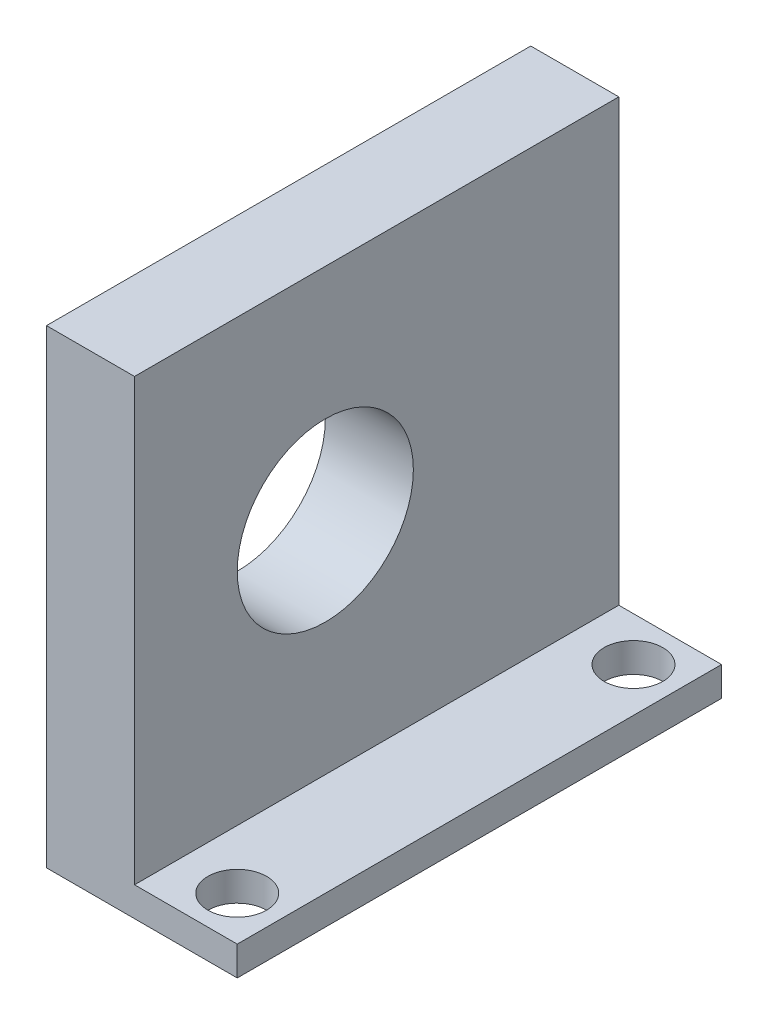
ISO-10303-21;
HEADER;
FILE_DESCRIPTION(('STEP AP214'),'2;1');
FILE_NAME('part.step','',(''),(''),'','','');
FILE_SCHEMA(('AUTOMOTIVE_DESIGN { 1 0 10303 214 1 1 1 1 }'));
ENDSEC;
DATA;
#1=APPLICATION_CONTEXT('core data for automotive mechanical design processes');
#2=APPLICATION_PROTOCOL_DEFINITION('international standard','automotive_design',2000,#1);
#3=PRODUCT_CONTEXT('',#1,'mechanical');
#4=PRODUCT('Part','Part','',(#3));
#5=PRODUCT_RELATED_PRODUCT_CATEGORY('part','',(#4));
#6=PRODUCT_DEFINITION_FORMATION('','',#4);
#7=PRODUCT_DEFINITION_CONTEXT('part definition',#1,'design');
#8=PRODUCT_DEFINITION('design','',#6,#7);
#9=PRODUCT_DEFINITION_SHAPE('','',#8);
#10=(LENGTH_UNIT() NAMED_UNIT(*) SI_UNIT(.MILLI.,.METRE.));
#11=(NAMED_UNIT(*) PLANE_ANGLE_UNIT() SI_UNIT($,.RADIAN.));
#12=(NAMED_UNIT(*) SI_UNIT($,.STERADIAN.) SOLID_ANGLE_UNIT());
#13=UNCERTAINTY_MEASURE_WITH_UNIT(LENGTH_MEASURE(1.E-05),#10,'distance_accuracy_value','');
#14=(GEOMETRIC_REPRESENTATION_CONTEXT(3) GLOBAL_UNCERTAINTY_ASSIGNED_CONTEXT((#13)) GLOBAL_UNIT_ASSIGNED_CONTEXT((#10,
#11,#12)) REPRESENTATION_CONTEXT('',''));
#15=CARTESIAN_POINT('',(0.,0.,0.));
#16=DIRECTION('',(0.,0.,1.));
#17=DIRECTION('',(1.,0.,0.));
#18=AXIS2_PLACEMENT_3D('',#15,#16,#17);
#19=CARTESIAN_POINT('',(13.,0.,33.));
#20=DIRECTION('',(0.,1.,0.));
#21=DIRECTION('',(-1.,0.,0.));
#22=AXIS2_PLACEMENT_3D('',#19,#20,#21);
#23=PLANE('',#22);
#24=CARTESIAN_POINT('',(10.,0.,3.));
#25=DIRECTION('',(0.,1.,0.));
#26=DIRECTION('',(-1.,0.,0.));
#27=AXIS2_PLACEMENT_3D('',#24,#25,#26);
#28=CIRCLE('',#27,2.);
#29=CARTESIAN_POINT('',(8.,0.,3.));
#30=VERTEX_POINT('',#29);
#31=EDGE_CURVE('E167',#30,#30,#28,.F.);
#32=ORIENTED_EDGE('',*,*,#31,.F.);
#33=EDGE_LOOP('',(#32));
#34=FACE_BOUND('',#33,.T.);
#35=CARTESIAN_POINT('',(10.,0.,30.));
#36=DIRECTION('',(0.,1.,0.));
#37=DIRECTION('',(-1.,0.,0.));
#38=AXIS2_PLACEMENT_3D('',#35,#36,#37);
#39=CIRCLE('',#38,2.);
#40=CARTESIAN_POINT('',(8.,0.,30.));
#41=VERTEX_POINT('',#40);
#42=EDGE_CURVE('E170',#41,#41,#39,.F.);
#43=ORIENTED_EDGE('',*,*,#42,.F.);
#44=EDGE_LOOP('',(#43));
#45=FACE_BOUND('',#44,.T.);
#46=DIRECTION('',(1.,0.,0.));
#47=VECTOR('',#46,1.);
#48=CARTESIAN_POINT('',(13.,0.,0.));
#49=LINE('',#48,#47);
#50=CARTESIAN_POINT('',(0.,0.,0.));
#51=VERTEX_POINT('',#50);
#52=CARTESIAN_POINT('',(13.,0.,0.));
#53=VERTEX_POINT('',#52);
#54=EDGE_CURVE('E122',#51,#53,#49,.T.);
#55=ORIENTED_EDGE('',*,*,#54,.T.);
#56=DIRECTION('',(0.,0.,-1.));
#57=VECTOR('',#56,1.);
#58=CARTESIAN_POINT('',(13.,0.,33.));
#59=LINE('',#58,#57);
#60=CARTESIAN_POINT('',(13.,0.,33.));
#61=VERTEX_POINT('',#60);
#62=EDGE_CURVE('E11',#61,#53,#59,.T.);
#63=ORIENTED_EDGE('',*,*,#62,.F.);
#64=DIRECTION('',(1.,0.,0.));
#65=VECTOR('',#64,1.);
#66=CARTESIAN_POINT('',(13.,0.,33.));
#67=LINE('',#66,#65);
#68=CARTESIAN_POINT('',(0.,0.,33.));
#69=VERTEX_POINT('',#68);
#70=EDGE_CURVE('E133',#69,#61,#67,.T.);
#71=ORIENTED_EDGE('',*,*,#70,.F.);
#72=DIRECTION('',(0.,0.,-1.));
#73=VECTOR('',#72,1.);
#74=CARTESIAN_POINT('',(0.,0.,33.));
#75=LINE('',#74,#73);
#76=EDGE_CURVE('E118',#69,#51,#75,.T.);
#77=ORIENTED_EDGE('',*,*,#76,.T.);
#78=EDGE_LOOP('',(#55,#63,#71,#77));
#79=FACE_BOUND('',#78,.T.);
#80=ADVANCED_FACE('F38',(#34,#45,#79),#23,.F.);
#81=CARTESIAN_POINT('',(13.,2.,33.));
#82=DIRECTION('',(-1.,0.,0.));
#83=DIRECTION('',(0.,0.,1.));
#84=AXIS2_PLACEMENT_3D('',#81,#82,#83);
#85=PLANE('',#84);
#86=DIRECTION('',(0.,1.,0.));
#87=VECTOR('',#86,1.);
#88=CARTESIAN_POINT('',(13.,2.,0.));
#89=LINE('',#88,#87);
#90=CARTESIAN_POINT('',(13.,2.,0.));
#91=VERTEX_POINT('',#90);
#92=EDGE_CURVE('E125',#53,#91,#89,.T.);
#93=ORIENTED_EDGE('',*,*,#92,.T.);
#94=DIRECTION('',(0.,0.,-1.));
#95=VECTOR('',#94,1.);
#96=CARTESIAN_POINT('',(13.,2.,33.));
#97=LINE('',#96,#95);
#98=CARTESIAN_POINT('',(13.,2.,33.));
#99=VERTEX_POINT('',#98);
#100=EDGE_CURVE('E46',#99,#91,#97,.T.);
#101=ORIENTED_EDGE('',*,*,#100,.F.);
#102=DIRECTION('',(0.,1.,0.));
#103=VECTOR('',#102,1.);
#104=CARTESIAN_POINT('',(13.,2.,33.));
#105=LINE('',#104,#103);
#106=EDGE_CURVE('E91',#61,#99,#105,.T.);
#107=ORIENTED_EDGE('',*,*,#106,.F.);
#108=ORIENTED_EDGE('',*,*,#62,.T.);
#109=EDGE_LOOP('',(#93,#101,#107,#108));
#110=FACE_BOUND('',#109,.T.);
#111=ADVANCED_FACE('F159',(#110),#85,.F.);
#112=CARTESIAN_POINT('',(6.,2.,33.));
#113=DIRECTION('',(0.,-1.,0.));
#114=DIRECTION('',(1.,0.,0.));
#115=AXIS2_PLACEMENT_3D('',#112,#113,#114);
#116=PLANE('',#115);
#117=CARTESIAN_POINT('',(10.,2.,3.));
#118=DIRECTION('',(0.,1.,0.));
#119=DIRECTION('',(-1.,0.,0.));
#120=AXIS2_PLACEMENT_3D('',#117,#118,#119);
#121=CIRCLE('',#120,2.);
#122=CARTESIAN_POINT('',(8.,2.,3.));
#123=VERTEX_POINT('',#122);
#124=EDGE_CURVE('E172',#123,#123,#121,.T.);
#125=ORIENTED_EDGE('',*,*,#124,.F.);
#126=EDGE_LOOP('',(#125));
#127=FACE_BOUND('',#126,.T.);
#128=CARTESIAN_POINT('',(10.,2.,30.));
#129=DIRECTION('',(0.,1.,0.));
#130=DIRECTION('',(-1.,0.,0.));
#131=AXIS2_PLACEMENT_3D('',#128,#129,#130);
#132=CIRCLE('',#131,2.);
#133=CARTESIAN_POINT('',(8.,2.,30.));
#134=VERTEX_POINT('',#133);
#135=EDGE_CURVE('E173',#134,#134,#132,.T.);
#136=ORIENTED_EDGE('',*,*,#135,.F.);
#137=EDGE_LOOP('',(#136));
#138=FACE_BOUND('',#137,.T.);
#139=DIRECTION('',(-1.,0.,0.));
#140=VECTOR('',#139,1.);
#141=CARTESIAN_POINT('',(6.,2.,0.));
#142=LINE('',#141,#140);
#143=CARTESIAN_POINT('',(6.,2.,0.));
#144=VERTEX_POINT('',#143);
#145=EDGE_CURVE('E128',#91,#144,#142,.T.);
#146=ORIENTED_EDGE('',*,*,#145,.T.);
#147=DIRECTION('',(0.,0.,-1.));
#148=VECTOR('',#147,1.);
#149=CARTESIAN_POINT('',(6.,2.,33.));
#150=LINE('',#149,#148);
#151=CARTESIAN_POINT('',(6.,2.,33.));
#152=VERTEX_POINT('',#151);
#153=EDGE_CURVE('E113',#152,#144,#150,.T.);
#154=ORIENTED_EDGE('',*,*,#153,.F.);
#155=DIRECTION('',(-1.,0.,0.));
#156=VECTOR('',#155,1.);
#157=CARTESIAN_POINT('',(6.,2.,33.));
#158=LINE('',#157,#156);
#159=EDGE_CURVE('E104',#99,#152,#158,.T.);
#160=ORIENTED_EDGE('',*,*,#159,.F.);
#161=ORIENTED_EDGE('',*,*,#100,.T.);
#162=EDGE_LOOP('',(#146,#154,#160,#161));
#163=FACE_BOUND('',#162,.T.);
#164=ADVANCED_FACE('F139',(#127,#138,#163),#116,.F.);
#165=CARTESIAN_POINT('',(6.,32.,33.));
#166=DIRECTION('',(-1.,0.,0.));
#167=DIRECTION('',(0.,-1.,0.));
#168=AXIS2_PLACEMENT_3D('',#165,#166,#167);
#169=PLANE('',#168);
#170=CARTESIAN_POINT('',(6.,17.,20.));
#171=DIRECTION('',(1.,0.,0.));
#172=DIRECTION('',(0.,1.,0.));
#173=AXIS2_PLACEMENT_3D('',#170,#171,#172);
#174=CIRCLE('',#173,6.);
#175=CARTESIAN_POINT('',(6.,23.,20.));
#176=VERTEX_POINT('',#175);
#177=EDGE_CURVE('E181',#176,#176,#174,.T.);
#178=ORIENTED_EDGE('',*,*,#177,.F.);
#179=EDGE_LOOP('',(#178));
#180=FACE_BOUND('',#179,.T.);
#181=DIRECTION('',(0.,1.,0.));
#182=VECTOR('',#181,1.);
#183=CARTESIAN_POINT('',(6.,32.,0.));
#184=LINE('',#183,#182);
#185=CARTESIAN_POINT('',(6.,32.,0.));
#186=VERTEX_POINT('',#185);
#187=EDGE_CURVE('E112',#144,#186,#184,.T.);
#188=ORIENTED_EDGE('',*,*,#187,.T.);
#189=DIRECTION('',(0.,0.,-1.));
#190=VECTOR('',#189,1.);
#191=CARTESIAN_POINT('',(6.,32.,33.));
#192=LINE('',#191,#190);
#193=CARTESIAN_POINT('',(6.,32.,33.));
#194=VERTEX_POINT('',#193);
#195=EDGE_CURVE('E109',#194,#186,#192,.T.);
#196=ORIENTED_EDGE('',*,*,#195,.F.);
#197=DIRECTION('',(0.,1.,0.));
#198=VECTOR('',#197,1.);
#199=CARTESIAN_POINT('',(6.,32.,33.));
#200=LINE('',#199,#198);
#201=EDGE_CURVE('E98',#152,#194,#200,.T.);
#202=ORIENTED_EDGE('',*,*,#201,.F.);
#203=ORIENTED_EDGE('',*,*,#153,.T.);
#204=EDGE_LOOP('',(#188,#196,#202,#203));
#205=FACE_BOUND('',#204,.T.);
#206=ADVANCED_FACE('F110',(#180,#205),#169,.F.);
#207=CARTESIAN_POINT('',(0.,32.,33.));
#208=DIRECTION('',(0.,-1.,0.));
#209=DIRECTION('',(0.,0.,-1.));
#210=AXIS2_PLACEMENT_3D('',#207,#208,#209);
#211=PLANE('',#210);
#212=DIRECTION('',(-1.,0.,0.));
#213=VECTOR('',#212,1.);
#214=CARTESIAN_POINT('',(0.,32.,0.));
#215=LINE('',#214,#213);
#216=CARTESIAN_POINT('',(0.,32.,0.));
#217=VERTEX_POINT('',#216);
#218=EDGE_CURVE('E77',#186,#217,#215,.T.);
#219=ORIENTED_EDGE('',*,*,#218,.T.);
#220=DIRECTION('',(0.,0.,-1.));
#221=VECTOR('',#220,1.);
#222=CARTESIAN_POINT('',(0.,32.,33.));
#223=LINE('',#222,#221);
#224=CARTESIAN_POINT('',(0.,32.,33.));
#225=VERTEX_POINT('',#224);
#226=EDGE_CURVE('E114',#225,#217,#223,.T.);
#227=ORIENTED_EDGE('',*,*,#226,.F.);
#228=DIRECTION('',(-1.,0.,0.));
#229=VECTOR('',#228,1.);
#230=CARTESIAN_POINT('',(0.,32.,33.));
#231=LINE('',#230,#229);
#232=EDGE_CURVE('E102',#194,#225,#231,.T.);
#233=ORIENTED_EDGE('',*,*,#232,.F.);
#234=ORIENTED_EDGE('',*,*,#195,.T.);
#235=EDGE_LOOP('',(#219,#227,#233,#234));
#236=FACE_BOUND('',#235,.T.);
#237=ADVANCED_FACE('F116',(#236),#211,.F.);
#238=CARTESIAN_POINT('',(0.,0.,33.));
#239=DIRECTION('',(1.,0.,0.));
#240=DIRECTION('',(0.,0.,-1.));
#241=AXIS2_PLACEMENT_3D('',#238,#239,#240);
#242=PLANE('',#241);
#243=CARTESIAN_POINT('',(0.,17.,20.));
#244=DIRECTION('',(1.,0.,0.));
#245=DIRECTION('',(0.,0.,-1.));
#246=AXIS2_PLACEMENT_3D('',#243,#244,#245);
#247=CIRCLE('',#246,6.);
#248=CARTESIAN_POINT('',(0.,17.,14.));
#249=VERTEX_POINT('',#248);
#250=EDGE_CURVE('E126',#249,#249,#247,.F.);
#251=ORIENTED_EDGE('',*,*,#250,.F.);
#252=EDGE_LOOP('',(#251));
#253=FACE_BOUND('',#252,.T.);
#254=DIRECTION('',(0.,-1.,0.));
#255=VECTOR('',#254,1.);
#256=CARTESIAN_POINT('',(0.,0.,0.));
#257=LINE('',#256,#255);
#258=EDGE_CURVE('E83',#217,#51,#257,.T.);
#259=ORIENTED_EDGE('',*,*,#258,.T.);
#260=ORIENTED_EDGE('',*,*,#76,.F.);
#261=DIRECTION('',(0.,-1.,0.));
#262=VECTOR('',#261,1.);
#263=CARTESIAN_POINT('',(0.,0.,33.));
#264=LINE('',#263,#262);
#265=EDGE_CURVE('E54',#225,#69,#264,.T.);
#266=ORIENTED_EDGE('',*,*,#265,.F.);
#267=ORIENTED_EDGE('',*,*,#226,.T.);
#268=EDGE_LOOP('',(#259,#260,#266,#267));
#269=FACE_BOUND('',#268,.T.);
#270=ADVANCED_FACE('F146',(#253,#269),#242,.F.);
#271=CARTESIAN_POINT('',(0.,0.,33.));
#272=DIRECTION('',(0.,0.,-1.));
#273=DIRECTION('',(-1.,0.,0.));
#274=AXIS2_PLACEMENT_3D('',#271,#272,#273);
#275=PLANE('',#274);
#276=ORIENTED_EDGE('',*,*,#70,.T.);
#277=ORIENTED_EDGE('',*,*,#106,.T.);
#278=ORIENTED_EDGE('',*,*,#159,.T.);
#279=ORIENTED_EDGE('',*,*,#201,.T.);
#280=ORIENTED_EDGE('',*,*,#232,.T.);
#281=ORIENTED_EDGE('',*,*,#265,.T.);
#282=EDGE_LOOP('',(#276,#277,#278,#279,#280,#281));
#283=FACE_BOUND('',#282,.T.);
#284=ADVANCED_FACE('F100',(#283),#275,.F.);
#285=CARTESIAN_POINT('',(0.,0.,0.));
#286=DIRECTION('',(0.,0.,-1.));
#287=DIRECTION('',(-1.,0.,0.));
#288=AXIS2_PLACEMENT_3D('',#285,#286,#287);
#289=PLANE('',#288);
#290=ORIENTED_EDGE('',*,*,#54,.F.);
#291=ORIENTED_EDGE('',*,*,#258,.F.);
#292=ORIENTED_EDGE('',*,*,#218,.F.);
#293=ORIENTED_EDGE('',*,*,#187,.F.);
#294=ORIENTED_EDGE('',*,*,#145,.F.);
#295=ORIENTED_EDGE('',*,*,#92,.F.);
#296=EDGE_LOOP('',(#290,#291,#292,#293,#294,#295));
#297=FACE_BOUND('',#296,.T.);
#298=ADVANCED_FACE('F142',(#297),#289,.T.);
#299=CARTESIAN_POINT('',(-0.00100000000000187,17.,20.));
#300=DIRECTION('',(1.,0.,0.));
#301=DIRECTION('',(0.,1.,0.));
#302=AXIS2_PLACEMENT_3D('',#299,#300,#301);
#303=CYLINDRICAL_SURFACE('',#302,6.);
#304=ORIENTED_EDGE('',*,*,#177,.T.);
#305=EDGE_LOOP('',(#304));
#306=FACE_BOUND('',#305,.T.);
#307=ORIENTED_EDGE('',*,*,#250,.T.);
#308=EDGE_LOOP('',(#307));
#309=FACE_BOUND('',#308,.T.);
#310=ADVANCED_FACE('F188',(#306,#309),#303,.F.);
#311=CARTESIAN_POINT('',(10.,-0.0010000000000049,30.));
#312=DIRECTION('',(0.,1.,0.));
#313=DIRECTION('',(-1.,0.,0.));
#314=AXIS2_PLACEMENT_3D('',#311,#312,#313);
#315=CYLINDRICAL_SURFACE('',#314,2.);
#316=ORIENTED_EDGE('',*,*,#135,.T.);
#317=EDGE_LOOP('',(#316));
#318=FACE_BOUND('',#317,.T.);
#319=ORIENTED_EDGE('',*,*,#42,.T.);
#320=EDGE_LOOP('',(#319));
#321=FACE_BOUND('',#320,.T.);
#322=ADVANCED_FACE('F190',(#318,#321),#315,.F.);
#323=CARTESIAN_POINT('',(10.,-0.0010000000000049,3.));
#324=DIRECTION('',(0.,1.,0.));
#325=DIRECTION('',(-1.,0.,0.));
#326=AXIS2_PLACEMENT_3D('',#323,#324,#325);
#327=CYLINDRICAL_SURFACE('',#326,2.);
#328=ORIENTED_EDGE('',*,*,#124,.T.);
#329=EDGE_LOOP('',(#328));
#330=FACE_BOUND('',#329,.T.);
#331=ORIENTED_EDGE('',*,*,#31,.T.);
#332=EDGE_LOOP('',(#331));
#333=FACE_BOUND('',#332,.T.);
#334=ADVANCED_FACE('F197',(#330,#333),#327,.F.);
#335=CLOSED_SHELL('',(#80,#111,#164,#206,#237,#270,#284,#298,#310,#322,#334));
#336=MANIFOLD_SOLID_BREP('B2',#335);
#337=ADVANCED_BREP_SHAPE_REPRESENTATION('',(#18,#336),#14);
#338=SHAPE_DEFINITION_REPRESENTATION(#9,#337);
ENDSEC;
END-ISO-10303-21;
